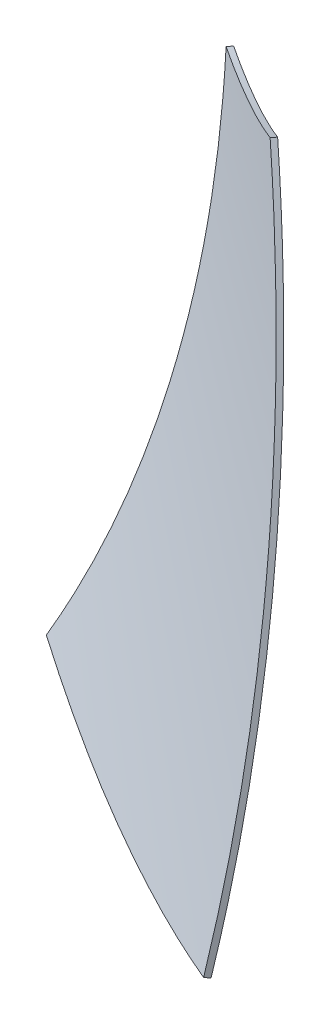
ISO-10303-21;
HEADER;
FILE_DESCRIPTION(('STEP AP214'),'2;1');
FILE_NAME('part.step','',(''),(''),'','','');
FILE_SCHEMA(('AUTOMOTIVE_DESIGN { 1 0 10303 214 1 1 1 1 }'));
ENDSEC;
DATA;
#1=APPLICATION_CONTEXT('core data for automotive mechanical design processes');
#2=APPLICATION_PROTOCOL_DEFINITION('international standard','automotive_design',2000,#1);
#3=PRODUCT_CONTEXT('',#1,'mechanical');
#4=PRODUCT('Part','Part','',(#3));
#5=PRODUCT_RELATED_PRODUCT_CATEGORY('part','',(#4));
#6=PRODUCT_DEFINITION_FORMATION('','',#4);
#7=PRODUCT_DEFINITION_CONTEXT('part definition',#1,'design');
#8=PRODUCT_DEFINITION('design','',#6,#7);
#9=PRODUCT_DEFINITION_SHAPE('','',#8);
#10=(LENGTH_UNIT() NAMED_UNIT(*) SI_UNIT(.MILLI.,.METRE.));
#11=(NAMED_UNIT(*) PLANE_ANGLE_UNIT() SI_UNIT($,.RADIAN.));
#12=(NAMED_UNIT(*) SI_UNIT($,.STERADIAN.) SOLID_ANGLE_UNIT());
#13=UNCERTAINTY_MEASURE_WITH_UNIT(LENGTH_MEASURE(1.E-05),#10,'distance_accuracy_value','');
#14=(GEOMETRIC_REPRESENTATION_CONTEXT(3) GLOBAL_UNCERTAINTY_ASSIGNED_CONTEXT((#13)) GLOBAL_UNIT_ASSIGNED_CONTEXT((#10,
#11,#12)) REPRESENTATION_CONTEXT('',''));
#15=CARTESIAN_POINT('',(0.,0.,0.));
#16=DIRECTION('',(0.,0.,1.));
#17=DIRECTION('',(1.,0.,0.));
#18=AXIS2_PLACEMENT_3D('',#15,#16,#17);
#19=CARTESIAN_POINT('',(78.7572236794685,-147.431615559738,-2.70380006520979));
#20=DIRECTION('',(0.,0.,1.));
#21=DIRECTION('',(1.,0.,0.));
#22=AXIS2_PLACEMENT_3D('',#19,#20,#21);
#23=CONICAL_SURFACE('',#22,60.5897364806192,0.959931088596881);
#24=CARTESIAN_POINT('',(134.605788151962,-170.731342459802,-2.75685890943691));
#25=CARTESIAN_POINT('',(134.616379422392,-170.599905018266,-2.78545030492909));
#26=CARTESIAN_POINT('',(134.626494640767,-170.468437161275,-2.81408465082089));
#27=CARTESIAN_POINT('',(134.674696797151,-169.810914395814,-2.95747729913719));
#28=CARTESIAN_POINT('',(134.705649660578,-169.284456858747,-3.07286623159333));
#29=CARTESIAN_POINT('',(134.752405609386,-168.231141664575,-3.30487191222422));
#30=CARTESIAN_POINT('',(134.76820871146,-167.70428400791,-3.42148865904589));
#31=CARTESIAN_POINT('',(134.780585250036,-166.914055799885,-3.5972602758251));
#32=CARTESIAN_POINT('',(134.782822871121,-166.650665898114,-3.6559896990414));
#33=CARTESIAN_POINT('',(134.78387792687,-165.860524444883,-3.8326053593522));
#34=CARTESIAN_POINT('',(134.77703639153,-165.333839934437,-3.95091040199067));
#35=CARTESIAN_POINT('',(134.755467554151,-164.544356782964,-4.12914125187959));
#36=CARTESIAN_POINT('',(134.746394061584,-164.281296012143,-4.18867820945749));
#37=CARTESIAN_POINT('',(134.713516518552,-163.492378807958,-4.36768755157999));
#38=CARTESIAN_POINT('',(134.684055908318,-162.966826440065,-4.48754965638362));
#39=CARTESIAN_POINT('',(134.628549070597,-162.179522634174,-4.66807514079438));
#40=CARTESIAN_POINT('',(134.608161764705,-161.917268475155,-4.72837011986974));
#41=CARTESIAN_POINT('',(134.541320382958,-161.131021855644,-4.90964328934642));
#42=CARTESIAN_POINT('',(134.489189043302,-160.607584560454,-5.03100075054007));
#43=CARTESIAN_POINT('',(134.369887819766,-159.562650395027,-5.27462133272372));
#44=CARTESIAN_POINT('',(134.302717953155,-159.041153522564,-5.39688445267364));
#45=CARTESIAN_POINT('',(134.153498987867,-158.000475071038,-5.64218771474003));
#46=CARTESIAN_POINT('',(134.071449905605,-157.481293489421,-5.76522785599921));
#47=CARTESIAN_POINT('',(133.892595398491,-156.44564029348,-6.01198001529259));
#48=CARTESIAN_POINT('',(133.795789984056,-155.929168677243,-6.13569203285243));
#49=CARTESIAN_POINT('',(133.587533246156,-154.89932712671,-6.38369513521577));
#50=CARTESIAN_POINT('',(133.476081927413,-154.385957191414,-6.50798621983248));
#51=CARTESIAN_POINT('',(133.238625080491,-153.362715863217,-6.75707079689549));
#52=CARTESIAN_POINT('',(133.112619551576,-152.852844470493,-6.88186428936714));
#53=CARTESIAN_POINT('',(132.846135034091,-151.837009863871,-7.13188782472667));
#54=CARTESIAN_POINT('',(132.705656039494,-151.331046651601,-7.25711786779628));
#55=CARTESIAN_POINT('',(132.31718431026,-150.005863701452,-7.58703763637144));
#56=CARTESIAN_POINT('',(132.057236898673,-149.190215835304,-7.79205738596347));
#57=CARTESIAN_POINT('',(131.778238301303,-148.381161591235,-7.99752302693639));
#58=B_SPLINE_CURVE_WITH_KNOTS('',3,(#24,#25,#26,#27,#28,#29,#30,#31,#32,#33,#34,#35,#36,#37,#38,
#39,#40,#41,#42,#43,#44,#45,#46,#47,#48,#49,#50,#51,#52,#53,#54,#55,#56,#57),.UNSPECIFIED.,.F.,
.F.,(4,2,2,2,2,2,2,2,2,2,2,2,2,2,2,2,4),(0.,0.404785646727015,2.02407998914106,3.6433725472241,
4.45295865029204,6.07225005229778,6.88183612887484,8.50112803684856,9.31071428467748,
10.9300078682216,12.5492995924441,14.1685895304152,15.7878783252783,17.4071665978865,
19.0264549522225,20.6457439807202,23.2857175866183),.UNSPECIFIED.);
#59=CARTESIAN_POINT('',(134.605788151962,-170.731342459802,-2.75685890943716));
#60=VERTEX_POINT('',#59);
#61=CARTESIAN_POINT('',(131.778238301303,-148.381161591235,-7.99752302693637));
#62=VERTEX_POINT('',#61);
#63=EDGE_CURVE('E23',#60,#62,#58,.T.);
#64=ORIENTED_EDGE('',*,*,#63,.T.);
#65=CARTESIAN_POINT('',(131.778238301303,-148.381161591235,-7.99752302693637));
#66=CARTESIAN_POINT('',(131.676082089635,-148.432906669615,-8.06839270908251));
#67=CARTESIAN_POINT('',(131.573463577942,-148.483385174219,-8.13954595753035));
#68=CARTESIAN_POINT('',(131.057913682385,-148.729617202499,-8.49686090490615));
#69=CARTESIAN_POINT('',(130.638510274614,-148.906424838884,-8.78704423252481));
#70=CARTESIAN_POINT('',(129.965302244953,-149.155460433756,-9.25266430868806));
#71=CARTESIAN_POINT('',(129.714699110871,-149.240708919067,-9.42595602925553));
#72=CARTESIAN_POINT('',(129.355390985677,-149.352601078064,-9.67445744911128));
#73=CARTESIAN_POINT('',(129.247832687924,-149.384788905845,-9.74885104371535));
#74=CARTESIAN_POINT('',(128.768539674748,-149.522465084773,-10.0804026850157));
#75=CARTESIAN_POINT('',(128.394166766565,-149.614661394808,-10.3394946224091));
#76=CARTESIAN_POINT('',(127.908854960768,-149.714768644672,-10.6757424971137));
#77=CARTESIAN_POINT('',(127.799550205187,-149.736054573479,-10.7514987942413));
#78=CARTESIAN_POINT('',(127.320584522723,-149.823809537646,-11.0835807574494));
#79=CARTESIAN_POINT('',(126.949494913093,-149.877442552936,-11.3411894895936));
#80=CARTESIAN_POINT('',(126.577335332167,-149.916836569792,-11.59999961285));
#81=B_SPLINE_CURVE_WITH_KNOTS('',3,(#65,#66,#67,#68,#69,#70,#71,#72,#73,#74,#75,#76,#77,#78,#79,
#80),.UNSPECIFIED.,.F.,.F.,(4,2,2,2,2,2,2,4),(0.,0.404039967202157,2.02138933713716,
2.97026784667493,3.37430460638505,4.76665393130048,5.17069019074693,6.53488990231797),.UNSPECIFIED.);
#82=CARTESIAN_POINT('',(126.57733532987,-149.916836570035,-11.5999996144474));
#83=VERTEX_POINT('',#82);
#84=EDGE_CURVE('E118',#62,#83,#81,.T.);
#85=ORIENTED_EDGE('',*,*,#84,.T.);
#86=CARTESIAN_POINT('',(126.57733532761,-149.916836569572,-11.5999996160448));
#87=CARTESIAN_POINT('',(126.570262013287,-150.052941781356,-11.5999996494659));
#88=CARTESIAN_POINT('',(126.562600085263,-150.189018799347,-11.6000047399862));
#89=CARTESIAN_POINT('',(126.52134828146,-150.869310846653,-11.6000530761268));
#90=CARTESIAN_POINT('',(126.47894309235,-151.413019044303,-11.6001649766074));
#91=CARTESIAN_POINT('',(126.375468099141,-152.498638332045,-11.6004735845136));
#92=CARTESIAN_POINT('',(126.31439831965,-153.040549424507,-11.6006702918274));
#93=CARTESIAN_POINT('',(126.173739377793,-154.121966756042,-11.6010958966157));
#94=CARTESIAN_POINT('',(126.094150235999,-154.661472997786,-11.6013247940543));
#95=CARTESIAN_POINT('',(125.916608138883,-155.737449210629,-11.6017712994759));
#96=CARTESIAN_POINT('',(125.818655199986,-156.273919184443,-11.6019889074689));
#97=CARTESIAN_POINT('',(125.604541866421,-157.343227337744,-11.6023789968134));
#98=CARTESIAN_POINT('',(125.48838148398,-157.876065519671,-11.6025514781953));
#99=CARTESIAN_POINT('',(125.300629870697,-158.672064328338,-11.6027589088289));
#100=CARTESIAN_POINT('',(125.235798048943,-158.936839890367,-11.6028195019013));
#101=CARTESIAN_POINT('',(125.034553127391,-159.729534789464,-11.602972686669));
#102=CARTESIAN_POINT('',(124.89140312878,-160.255764743476,-11.6030366646343));
#103=CARTESIAN_POINT('',(124.587332508507,-161.303046127741,-11.6030799623009));
#104=CARTESIAN_POINT('',(124.426411888593,-161.824097558504,-11.6030592820105));
#105=CARTESIAN_POINT('',(124.08697119315,-162.86045533843,-11.6029358242954));
#106=CARTESIAN_POINT('',(123.908451115275,-163.375761686827,-11.6028330468597));
#107=CARTESIAN_POINT('',(123.627641997148,-164.143883328966,-11.6026274061341));
#108=CARTESIAN_POINT('',(123.531872985049,-164.399103901087,-11.6025502856885));
#109=CARTESIAN_POINT('',(123.238048465891,-165.162342037329,-11.602297081799));
#110=CARTESIAN_POINT('',(123.03349488552,-165.667879992409,-11.6020991678247));
#111=CARTESIAN_POINT('',(122.607285311471,-166.671676100523,-11.6016733387503));
#112=CARTESIAN_POINT('',(122.385629305724,-167.169934248419,-11.601445423629));
#113=CARTESIAN_POINT('',(121.9254093993,-168.158599267833,-11.6009981951401));
#114=CARTESIAN_POINT('',(121.686845482937,-168.649006132067,-11.6007788817804));
#115=CARTESIAN_POINT('',(121.316518082209,-169.378204865842,-11.6004924206061));
#116=CARTESIAN_POINT('',(121.191002582458,-169.620189429101,-11.6004040220393));
#117=CARTESIAN_POINT('',(120.740581361943,-170.470604777717,-11.600129637712));
#118=CARTESIAN_POINT('',(120.404486637765,-171.073117536086,-11.6000013307999));
#119=CARTESIAN_POINT('',(120.055309686639,-171.668106511457,-11.599999616045));
#120=B_SPLINE_CURVE_WITH_KNOTS('',3,(#86,#87,#88,#89,#90,#91,#92,#93,#94,#95,#96,#97,#98,#99,
#100,#101,#102,#103,#104,#105,#106,#107,#108,#109,#110,#111,#112,#113,#114,#115,#116,#117,#118,
#119),.UNSPECIFIED.,.F.,.F.,(4,2,2,2,2,2,2,2,2,2,2,2,2,2,2,2,4),(0.,0.408872020867714,
2.0445880712592,3.68030196493978,5.31601404164167,6.95172465537327,8.58743417068849,
9.40520007433018,11.0409086409511,12.6766170468338,14.3123256708841,15.1300916008259,
16.7658012589311,18.4015120712798,20.0372244010418,20.8549909268166,22.9242005441206),.UNSPECIFIED.);
#121=CARTESIAN_POINT('',(120.055309688549,-171.668106529233,-11.5999996085917));
#122=VERTEX_POINT('',#121);
#123=EDGE_CURVE('E68',#83,#122,#120,.T.);
#124=ORIENTED_EDGE('',*,*,#123,.T.);
#125=CARTESIAN_POINT('',(120.05530969046,-171.668106547008,-11.5999996011384));
#126=CARTESIAN_POINT('',(120.167436927589,-171.683227183543,-11.5269277899671));
#127=CARTESIAN_POINT('',(120.27967512345,-171.697855483783,-11.4539216420114));
#128=CARTESIAN_POINT('',(120.616732153969,-171.740237152483,-11.2350974851369));
#129=CARTESIAN_POINT('',(120.8418759287,-171.766484765654,-11.0894852132953));
#130=CARTESIAN_POINT('',(121.180225060753,-171.802732751531,-10.8715030041362));
#131=CARTESIAN_POINT('',(121.293121535014,-171.814295534771,-10.79890994795));
#132=CARTESIAN_POINT('',(121.519117195239,-171.836367143061,-10.6538745044603));
#133=CARTESIAN_POINT('',(121.63221638493,-171.846875948522,-10.5814321199817));
#134=CARTESIAN_POINT('',(121.972363768017,-171.876822469324,-10.3639917884703));
#135=CARTESIAN_POINT('',(122.199712448089,-171.894621168894,-10.2192346185964));
#136=CARTESIAN_POINT('',(122.655102706292,-171.925989862103,-9.93034424876074));
#137=CARTESIAN_POINT('',(122.883144305428,-171.939559726233,-9.78621106804204));
#138=CARTESIAN_POINT('',(123.339795680005,-171.962830793169,-9.49849022503179));
#139=CARTESIAN_POINT('',(123.568405502072,-171.972531667196,-9.35490261012765));
#140=CARTESIAN_POINT('',(124.026159377397,-171.987773898679,-9.06836010831092));
#141=CARTESIAN_POINT('',(124.255303427241,-171.993315282636,-8.9254052173728));
#142=CARTESIAN_POINT('',(124.714080806761,-172.000040947843,-8.64018634924556));
#143=CARTESIAN_POINT('',(124.943714126804,-172.001225314084,-8.4979223586333));
#144=CARTESIAN_POINT('',(125.403408059095,-171.999129731051,-8.21412198035418));
#145=CARTESIAN_POINT('',(125.633468674846,-171.995849745019,-8.07258559868775));
#146=CARTESIAN_POINT('',(126.324117391908,-171.979339146702,-7.64911041754293));
#147=CARTESIAN_POINT('',(126.785239905162,-171.959438892242,-7.36826361088097));
#148=CARTESIAN_POINT('',(127.476857356153,-171.916591389211,-6.94955539336827));
#149=CARTESIAN_POINT('',(127.70710813763,-171.9001702724,-6.8105788589419));
#150=CARTESIAN_POINT('',(128.167681959757,-171.863022231064,-6.53337967033593));
#151=CARTESIAN_POINT('',(128.398004989143,-171.842295798785,-6.39515693182397));
#152=CARTESIAN_POINT('',(129.08902636021,-171.77367482908,-5.98159607607306));
#153=CARTESIAN_POINT('',(129.549766238453,-171.719339285448,-5.70737182091689));
#154=CARTESIAN_POINT('',(130.470731870811,-171.59343826166,-5.16201971943314));
#155=CARTESIAN_POINT('',(130.930957623737,-171.52187274172,-4.89089188025676));
#156=CARTESIAN_POINT('',(131.620396203786,-171.401434367381,-4.48668233293494));
#157=CARTESIAN_POINT('',(131.850047699047,-171.359108981576,-4.35236611271707));
#158=CARTESIAN_POINT('',(132.501930077152,-171.232610822881,-3.97199678509201));
#159=CARTESIAN_POINT('',(132.923739345775,-171.143173179397,-3.72694440622015));
#160=CARTESIAN_POINT('',(133.766017522951,-170.948897956325,-3.23966262907043));
#161=CARTESIAN_POINT('',(134.186484679992,-170.844045140587,-2.99743628264901));
#162=CARTESIAN_POINT('',(134.605788151962,-170.731342459802,-2.75685890943752));
#163=B_SPLINE_CURVE_WITH_KNOTS('',3,(#125,#126,#127,#128,#129,#130,#131,#132,#133,#134,#135,
#136,#137,#138,#139,#140,#141,#142,#143,#144,#145,#146,#147,#148,#149,#150,#151,#152,#153,#154,
#155,#156,#157,#158,#159,#160,#161,#162),.UNSPECIFIED.,.F.,.F.,(4,2,2,2,2,2,2,2,2,2,2,2,2,2,2,2,
2,2,4),(0.,0.404064075829709,1.21225542173454,1.61640715853335,2.02056640495023,2.8308531195042,
3.64116464685769,4.45154501796617,5.26192022580696,6.07227962579751,6.88264569796902,
8.50313937763985,9.31144122089318,10.1196506981843,11.7361073687768,13.3525677718332,
14.1607178925077,15.6483250247952,17.1374124981753),.UNSPECIFIED.);
#164=EDGE_CURVE('E65',#122,#60,#163,.T.);
#165=ORIENTED_EDGE('',*,*,#164,.T.);
#166=EDGE_LOOP('',(#64,#85,#124,#165));
#167=FACE_BOUND('',#166,.T.);
#168=ADVANCED_FACE('F16',(#167),#23,.F.);
#169=CARTESIAN_POINT('',(131.894082165788,-148.383236223013,-8.16299173988275));
#170=CARTESIAN_POINT('',(131.893699842803,-148.383229376043,-8.16244563851989));
#171=CARTESIAN_POINT('',(131.893317519818,-148.383222529074,-8.16189953715703));
#172=CARTESIAN_POINT('',(131.892935196833,-148.383215682104,-8.16135343579417));
#173=CARTESIAN_POINT('',(131.854702898323,-148.382530985148,-8.10674329950824));
#174=CARTESIAN_POINT('',(131.816470599813,-148.381846288191,-8.05213316322231));
#175=CARTESIAN_POINT('',(131.778238301303,-148.381161591235,-7.99752302693637));
#176=CARTESIAN_POINT('',(133.299440158477,-152.467639566394,-7.12789737510281));
#177=CARTESIAN_POINT('',(133.299058354373,-152.467603503838,-7.12735127373995));
#178=CARTESIAN_POINT('',(133.298676550269,-152.467567441283,-7.12680517237709));
#179=CARTESIAN_POINT('',(133.298294746165,-152.467531378727,-7.12625907101423));
#180=CARTESIAN_POINT('',(133.260114335778,-152.463925123164,-7.0716489347283));
#181=CARTESIAN_POINT('',(133.221935126975,-152.460324418764,-7.01703879844237));
#182=CARTESIAN_POINT('',(133.183754716589,-152.456718163202,-6.96242866215643));
#183=CARTESIAN_POINT('',(134.929019860243,-159.974452727746,-5.31572352005377));
#184=CARTESIAN_POINT('',(134.928644826751,-159.974367365664,-5.31517741869091));
#185=CARTESIAN_POINT('',(134.92826979326,-159.974282003582,-5.31463131732805));
#186=CARTESIAN_POINT('',(134.927894759768,-159.9741966415,-5.31408521596519));
#187=CARTESIAN_POINT('',(134.890391410609,-159.965660433293,-5.25947507967926));
#188=CARTESIAN_POINT('',(134.852887826046,-159.957121979647,-5.20486494339333));
#189=CARTESIAN_POINT('',(134.815384476887,-159.94858577144,-5.1502548071074));
#190=CARTESIAN_POINT('',(134.972016657127,-167.580555158911,-3.61624611019746));
#191=CARTESIAN_POINT('',(134.971656349512,-167.580425672958,-3.6157000088346));
#192=CARTESIAN_POINT('',(134.971296041898,-167.580296187006,-3.61515390747174));
#193=CARTESIAN_POINT('',(134.970935734283,-167.580166701053,-3.61460780610888));
#194=CARTESIAN_POINT('',(134.934904972825,-167.567218105797,-3.55999766982295));
#195=CARTESIAN_POINT('',(134.898874206017,-167.554270327607,-3.50538753353701));
#196=CARTESIAN_POINT('',(134.862843444559,-167.54132173235,-3.45077739725108));
#197=CARTESIAN_POINT('',(134.71271803879,-170.775953045303,-2.9223276223833));
#198=CARTESIAN_POINT('',(134.712365134873,-170.775805815648,-2.92178152102044));
#199=CARTESIAN_POINT('',(134.712012230956,-170.775658585993,-2.92123541965758));
#200=CARTESIAN_POINT('',(134.711659327039,-170.775511356338,-2.92068931829472));
#201=CARTESIAN_POINT('',(134.676368935347,-170.760788390826,-2.86607918200879));
#202=CARTESIAN_POINT('',(134.641078543655,-170.746065425314,-2.81146904572285));
#203=CARTESIAN_POINT('',(134.605788151962,-170.731342459802,-2.75685890943692));
#204=B_SPLINE_SURFACE_WITH_KNOTS('',3,3,((#169,#170,#171,#172,#173,#174,#175),(#176,#177,#178,
#179,#180,#181,#182),(#183,#184,#185,#186,#187,#188,#189),(#190,#191,#192,#193,#194,#195,#196),
(#197,#198,#199,#200,#201,#202,#203)),.UNSPECIFIED.,.F.,.F.,.F.,(4,1,4),(4,3,4),(0.,
0.571428571428571,1.),(-0.01,0.,1.),.UNSPECIFIED.);
#205=DIRECTION('',(-0.573484477649756,0.0102704543403194,0.819152044288745));
#206=VECTOR('',#205,1.);
#207=CARTESIAN_POINT('',(131.83501326459,-148.382178366215,-8.07861907932101));
#208=LINE('',#207,#206);
#209=CARTESIAN_POINT('',(131.890275275419,-148.383168642678,-8.15755361789312));
#210=VERTEX_POINT('',#209);
#211=EDGE_CURVE('E77',#210,#62,#208,.T.);
#212=DIRECTION('',(0.529355875382127,-0.220844482681004,-0.819152044292011));
#213=VECTOR('',#212,1.);
#214=CARTESIAN_POINT('',(134.6587237395,-170.75342690807,-2.8387741138661));
#215=LINE('',#214,#213);
#216=CARTESIAN_POINT('',(134.711659335653,-170.775511354014,-2.92068931335499));
#217=VERTEX_POINT('',#216);
#218=EDGE_CURVE('E72',#60,#217,#215,.T.);
#219=CARTESIAN_POINT('',(131.890275482189,-148.38316924312,-8.15755346593866));
#220=CARTESIAN_POINT('',(131.932578488578,-148.506013266826,-8.12646529974278));
#221=CARTESIAN_POINT('',(131.974443426525,-148.629012222785,-8.09538664209419));
#222=CARTESIAN_POINT('',(132.181590329431,-149.244807770085,-7.94003123078418));
#223=CARTESIAN_POINT('',(132.340292884504,-149.739873965315,-7.81590172399869));
#224=CARTESIAN_POINT('',(132.643601171173,-150.734379727811,-7.56799614008737));
#225=CARTESIAN_POINT('',(132.788206916985,-151.233819290665,-7.44422006260523));
#226=CARTESIAN_POINT('',(133.06327064616,-152.236683446434,-7.19705831847666));
#227=CARTESIAN_POINT('',(133.193728638925,-152.740108036701,-7.07367265157083));
#228=CARTESIAN_POINT('',(133.440421235467,-153.750516016524,-6.82735523018195));
#229=CARTESIAN_POINT('',(133.556655843781,-154.257499404946,-6.70442347555413));
#230=CARTESIAN_POINT('',(133.883994226757,-155.783643426141,-6.33630232355147));
#231=CARTESIAN_POINT('',(134.073654535592,-156.80771335659,-6.09185713269323));
#232=CARTESIAN_POINT('',(134.314517920459,-158.350729866243,-5.72736741440274));
#233=CARTESIAN_POINT('',(134.387527309107,-158.866147414491,-5.60625079154462));
#234=CARTESIAN_POINT('',(134.518906359033,-159.899066828554,-5.36481911959935));
#235=CARTESIAN_POINT('',(134.577276003636,-160.416568696742,-5.24450407142532));
#236=CARTESIAN_POINT('',(134.653725510535,-161.194024279569,-5.06474735316981));
#237=CARTESIAN_POINT('',(134.677357201017,-161.45336723249,-5.00494989898643));
#238=CARTESIAN_POINT('',(134.742708648277,-162.232001284413,-4.82590183247308));
#239=CARTESIAN_POINT('',(134.778880549789,-162.751860052717,-4.70700423832347));
#240=CARTESIAN_POINT('',(134.822058176357,-163.532361762357,-4.52940295256688));
#241=CARTESIAN_POINT('',(134.834603759245,-163.792638438459,-4.47032884487121));
#242=CARTESIAN_POINT('',(134.888124946639,-165.094986136432,-4.17547408939976));
#243=CARTESIAN_POINT('',(134.901412813862,-166.138825306815,-3.94149714261485));
#244=CARTESIAN_POINT('',(134.875764846212,-167.781803936912,-3.57668920994814));
#245=CARTESIAN_POINT('',(134.856657822295,-168.381030399083,-3.44436265463065));
#246=CARTESIAN_POINT('',(134.798862828021,-169.578859612488,-3.18130319049114));
#247=CARTESIAN_POINT('',(134.760175740196,-170.177462390615,-3.05057021011384));
#248=CARTESIAN_POINT('',(134.711659331516,-170.77551130116,-2.92068933027753));
#249=B_SPLINE_CURVE_WITH_KNOTS('',3,(#219,#220,#221,#222,#223,#224,#225,#226,#227,#228,#229,
#230,#231,#232,#233,#234,#235,#236,#237,#238,#239,#240,#241,#242,#243,#244,#245,#246,#247,#248),
.UNSPECIFIED.,.F.,.F.,(4,2,2,2,2,2,2,2,2,2,2,2,2,2,4),(0.,0.400777767878898,2.00403326314162,
3.60728714148174,5.21053995438169,6.81379225591896,10.0212055219878,11.6244597112299,
13.2277157265327,14.0292859402486,15.6325425997919,16.4341125799421,19.641548052603,
21.4831693810971,23.3247077095701),.UNSPECIFIED.);
#250=EDGE_CURVE('E112',#210,#217,#249,.T.);
#251=ORIENTED_EDGE('',*,*,#211,.T.);
#252=ORIENTED_EDGE('',*,*,#63,.F.);
#253=ORIENTED_EDGE('',*,*,#218,.T.);
#254=ORIENTED_EDGE('',*,*,#250,.F.);
#255=EDGE_LOOP('',(#251,#252,#253,#254));
#256=FACE_BOUND('',#255,.T.);
#257=ADVANCED_FACE('F74',(#256),#204,.F.);
#258=CARTESIAN_POINT('',(134.71271803879,-170.775953045303,-2.9223276223835));
#259=CARTESIAN_POINT('',(134.712365134873,-170.775805815648,-2.92178152102064));
#260=CARTESIAN_POINT('',(134.712012230956,-170.775658585993,-2.92123541965778));
#261=CARTESIAN_POINT('',(134.711659327039,-170.775511356338,-2.92068931829492));
#262=CARTESIAN_POINT('',(134.676368935347,-170.760788390826,-2.86607918200904));
#263=CARTESIAN_POINT('',(134.641078543654,-170.746065425314,-2.81146904572316));
#264=CARTESIAN_POINT('',(134.605788151962,-170.731342459802,-2.75685890943729));
#265=CARTESIAN_POINT('',(134.605431719006,-170.73119375785,-2.7563073470608));
#266=CARTESIAN_POINT('',(134.60507528605,-170.731045055899,-2.75575578468432));
#267=CARTESIAN_POINT('',(134.604718853094,-170.730896353947,-2.75520422230783));
#268=CARTESIAN_POINT('',(131.858716817371,-171.546038258217,-4.55903629348519));
#269=CARTESIAN_POINT('',(131.858368305276,-171.545880487361,-4.55849019212233));
#270=CARTESIAN_POINT('',(131.858019793182,-171.545722716504,-4.55794409075947));
#271=CARTESIAN_POINT('',(131.857671281088,-171.545564945648,-4.55739798939661));
#272=CARTESIAN_POINT('',(131.822820071663,-171.52978786002,-4.50278785311072));
#273=CARTESIAN_POINT('',(131.787969605582,-171.514013243101,-4.44817771682483));
#274=CARTESIAN_POINT('',(131.753118396156,-171.498236157473,-4.39356758053894));
#275=CARTESIAN_POINT('',(131.752766398941,-171.498076808908,-4.39301601816245));
#276=CARTESIAN_POINT('',(131.752414401726,-171.497917460343,-4.39246445578597));
#277=CARTESIAN_POINT('',(131.75206240451,-171.497758111778,-4.39191289340948));
#278=CARTESIAN_POINT('',(127.884208646433,-172.095860493621,-6.90070099144764));
#279=CARTESIAN_POINT('',(127.88386648746,-172.095689390152,-6.90015489008478));
#280=CARTESIAN_POINT('',(127.883524328486,-172.095518286684,-6.89960878872192));
#281=CARTESIAN_POINT('',(127.883182169512,-172.095347183215,-6.89906268735906));
#282=CARTESIAN_POINT('',(127.848966272135,-172.078236836353,-6.84445255107315));
#283=CARTESIAN_POINT('',(127.814749724108,-172.061127843676,-6.78984241478726));
#284=CARTESIAN_POINT('',(127.780533826732,-172.044017496814,-6.73523227850135));
#285=CARTESIAN_POINT('',(127.780188246168,-172.043844682311,-6.73468071612486));
#286=CARTESIAN_POINT('',(127.779842665605,-172.043671867807,-6.73412915374837));
#287=CARTESIAN_POINT('',(127.779497085041,-172.043499053304,-6.73357759137189));
#288=CARTESIAN_POINT('',(123.926690346646,-172.055469637622,-9.3552289579688));
#289=CARTESIAN_POINT('',(123.926354550327,-172.055286681247,-9.35468285660594));
#290=CARTESIAN_POINT('',(123.926018754009,-172.055103724873,-9.35413675524308));
#291=CARTESIAN_POINT('',(123.92568295769,-172.054920768498,-9.35359065388022));
#292=CARTESIAN_POINT('',(123.892103325816,-172.03662513103,-9.2989805175943));
#293=CARTESIAN_POINT('',(123.858524926945,-172.018326854063,-9.24437038130838));
#294=CARTESIAN_POINT('',(123.82494529507,-172.000031216595,-9.18976024502247));
#295=CARTESIAN_POINT('',(123.824606140788,-171.999846430657,-9.18920868264598));
#296=CARTESIAN_POINT('',(123.824266986506,-171.999661644718,-9.18865712026949));
#297=CARTESIAN_POINT('',(123.823927832224,-171.99947685878,-9.18810555789301));
#298=CARTESIAN_POINT('',(121.870883025791,-171.927974577641,-10.6558105147884));
#299=CARTESIAN_POINT('',(121.870550526431,-171.927785706276,-10.6552644134255));
#300=CARTESIAN_POINT('',(121.870218027071,-171.92759683491,-10.6547183120627));
#301=CARTESIAN_POINT('',(121.869885527711,-171.927407963545,-10.6541722106998));
#302=CARTESIAN_POINT('',(121.836635591713,-171.908520826998,-10.5995620744139));
#303=CARTESIAN_POINT('',(121.803384450612,-171.889636664793,-10.5449519381279));
#304=CARTESIAN_POINT('',(121.770134514614,-171.870749528246,-10.490341801842));
#305=CARTESIAN_POINT('',(121.76979869026,-171.870558768167,-10.4897902394655));
#306=CARTESIAN_POINT('',(121.769462865907,-171.870368008088,-10.489238677089));
#307=CARTESIAN_POINT('',(121.769127041553,-171.870177248009,-10.4886871147125));
#308=CARTESIAN_POINT('',(120.843558007019,-171.818965759095,-11.3171126533402));
#309=CARTESIAN_POINT('',(120.843227128988,-171.818774080378,-11.3165665519773));
#310=CARTESIAN_POINT('',(120.842896250956,-171.818582401661,-11.3160204506145));
#311=CARTESIAN_POINT('',(120.842565372925,-171.818390722944,-11.3154743492516));
#312=CARTESIAN_POINT('',(120.809477569791,-171.799222851259,-11.2608642129657));
#313=CARTESIAN_POINT('',(120.776391826752,-171.780050381983,-11.2062540766797));
#314=CARTESIAN_POINT('',(120.743304023618,-171.760882510297,-11.1516439403938));
#315=CARTESIAN_POINT('',(120.742969836806,-171.760688914793,-11.1510923780173));
#316=CARTESIAN_POINT('',(120.742635649995,-171.760495319289,-11.1505408156408));
#317=CARTESIAN_POINT('',(120.742301463183,-171.760301723785,-11.1499892532643));
#318=CARTESIAN_POINT('',(120.155235192587,-171.726749540529,-11.7654683091632));
#319=CARTESIAN_POINT('',(120.154905405477,-171.7265559993,-11.7649222078003));
#320=CARTESIAN_POINT('',(120.154575618366,-171.72636245807,-11.7643761064375));
#321=CARTESIAN_POINT('',(120.154245831255,-171.726168916841,-11.7638300050746));
#322=CARTESIAN_POINT('',(120.121267120174,-171.706814793903,-11.7092198687886));
#323=CARTESIAN_POINT('',(120.088288409093,-171.687460670965,-11.6546097325027));
#324=CARTESIAN_POINT('',(120.055309698012,-171.668106548026,-11.5999995962168));
#325=CARTESIAN_POINT('',(120.05497661303,-171.667911071384,-11.5994480338403));
#326=CARTESIAN_POINT('',(120.054643528048,-171.667715594743,-11.5988964714638));
#327=CARTESIAN_POINT('',(120.054310443066,-171.667520118101,-11.5983449090873));
#328=B_SPLINE_SURFACE_WITH_KNOTS('',3,3,((#258,#259,#260,#261,#262,#263,#264,#265,#266,#267),
(#268,#269,#270,#271,#272,#273,#274,#275,#276,#277),(#278,#279,#280,#281,#282,#283,#284,#285,
#286,#287),(#288,#289,#290,#291,#292,#293,#294,#295,#296,#297),(#298,#299,#300,#301,#302,#303,
#304,#305,#306,#307),(#308,#309,#310,#311,#312,#313,#314,#315,#316,#317),(#318,#319,#320,#321,
#322,#323,#324,#325,#326,#327)),.UNSPECIFIED.,.F.,.F.,.F.,(4,1,1,1,4),(4,3,3,4),(0.,
0.571428571428571,0.785714285714286,0.857142857142857,1.),(-0.01,0.,1.,1.0101),.UNSPECIFIED.);
#329=DIRECTION('',(0.49468066636607,-0.290311843817023,-0.819152044289204));
#330=VECTOR('',#329,1.);
#331=CARTESIAN_POINT('',(120.105661572297,-171.697656351614,-11.6833783341765));
#332=LINE('',#331,#330);
#333=CARTESIAN_POINT('',(120.153946954336,-171.725993386877,-11.7633350556308));
#334=VERTEX_POINT('',#333);
#335=EDGE_CURVE('E83',#122,#334,#332,.T.);
#336=CARTESIAN_POINT('',(134.711659344267,-170.77551135169,-2.92068930841487));
#337=CARTESIAN_POINT('',(134.599022770779,-170.805901993809,-2.98528436390957));
#338=CARTESIAN_POINT('',(134.486299765155,-170.835724902134,-3.04999990561551));
#339=CARTESIAN_POINT('',(133.922219670511,-170.982036947639,-3.37420320270312));
#340=CARTESIAN_POINT('',(133.469655072972,-171.090067313734,-3.63546016748508));
#341=CARTESIAN_POINT('',(132.561511635591,-171.288855881896,-4.16211517063904));
#342=CARTESIAN_POINT('',(132.10592798725,-171.379567586175,-4.42752234322105));
#343=CARTESIAN_POINT('',(131.193521143483,-171.54376092728,-4.96160385690283));
#344=CARTESIAN_POINT('',(130.736697851965,-171.617241187429,-5.23027845724542));
#345=CARTESIAN_POINT('',(129.82247016803,-171.74719997307,-5.77069154569681));
#346=CARTESIAN_POINT('',(129.365065791819,-171.803678962739,-6.04242994994573));
#347=CARTESIAN_POINT('',(128.45028238319,-171.899715533104,-6.58884192089342));
#348=CARTESIAN_POINT('',(127.99290335274,-171.93927478701,-6.86351519460501));
#349=CARTESIAN_POINT('',(127.307922470594,-171.985801157298,-7.27730498110584));
#350=CARTESIAN_POINT('',(127.080086093773,-171.99916501384,-7.4153425081823));
#351=CARTESIAN_POINT('',(126.624609017175,-172.021628298701,-7.69215125374788));
#352=CARTESIAN_POINT('',(126.396968343375,-172.030727228522,-7.83092255608692));
#353=CARTESIAN_POINT('',(125.941986149007,-172.044603099378,-8.10918824223283));
#354=CARTESIAN_POINT('',(125.714644639884,-172.049379879603,-8.24868265274926));
#355=CARTESIAN_POINT('',(125.26035600041,-172.054569140881,-8.52838545074058));
#356=CARTESIAN_POINT('',(125.033408864102,-172.054981688442,-8.66859382730226));
#357=CARTESIAN_POINT('',(124.579974532421,-172.051516872873,-8.94969561674471));
#358=CARTESIAN_POINT('',(124.353487334352,-172.047639534972,-9.09058902559191));
#359=CARTESIAN_POINT('',(123.901028587261,-172.035740825325,-9.37301290457971));
#360=CARTESIAN_POINT('',(123.675057026405,-172.027719549666,-9.51454335987343));
#361=CARTESIAN_POINT('',(123.223635195468,-172.007844329534,-9.79816494862187));
#362=CARTESIAN_POINT('',(122.998184926433,-171.995990377375,-9.94025608320025));
#363=CARTESIAN_POINT('',(122.553479969642,-171.968677340149,-10.2214816295592));
#364=CARTESIAN_POINT('',(122.334210422554,-171.953315062348,-10.3606018695906));
#365=CARTESIAN_POINT('',(121.896383172709,-171.918516568388,-10.639449919674));
#366=CARTESIAN_POINT('',(121.677825465558,-171.899080377422,-10.7791777259636));
#367=CARTESIAN_POINT('',(121.24125246558,-171.856256199712,-11.0593338440002));
#368=CARTESIAN_POINT('',(121.023237890187,-171.832864456324,-11.1997626973395));
#369=CARTESIAN_POINT('',(120.587993764444,-171.782262563482,-11.4811561474753));
#370=CARTESIAN_POINT('',(120.370764226568,-171.755052353619,-11.6221207527132));
#371=CARTESIAN_POINT('',(120.15394705232,-171.72599351449,-11.7633349512188));
#372=B_SPLINE_CURVE_WITH_KNOTS('',3,(#336,#337,#338,#339,#340,#341,#342,#343,#344,#345,#346,
#347,#348,#349,#350,#351,#352,#353,#354,#355,#356,#357,#358,#359,#360,#361,#362,#363,#364,#365,
#366,#367,#368,#369,#370,#371),.UNSPECIFIED.,.F.,.F.,(4,2,2,2,2,2,2,2,2,2,2,2,2,2,2,2,2,4),(0.,
0.400064412571046,2.00054437172465,3.60526272447642,5.21010923969993,6.81491193452582,
8.41955589197793,9.21970311274269,10.0199438339333,10.8202143274028,11.6204726249607,
12.4207262161695,13.2209612524099,14.0211978932216,14.8015678042819,15.5819328896222,
16.3630433043342,17.1441660777518),.UNSPECIFIED.);
#373=EDGE_CURVE('E80',#217,#334,#372,.T.);
#374=ORIENTED_EDGE('',*,*,#218,.F.);
#375=ORIENTED_EDGE('',*,*,#164,.F.);
#376=ORIENTED_EDGE('',*,*,#335,.T.);
#377=ORIENTED_EDGE('',*,*,#373,.F.);
#378=EDGE_LOOP('',(#374,#375,#376,#377));
#379=FACE_BOUND('',#378,.T.);
#380=ADVANCED_FACE('F78',(#379),#328,.F.);
#381=CARTESIAN_POINT('',(120.156013213605,-171.727206076965,-11.766756668353));
#382=CARTESIAN_POINT('',(120.155424163824,-171.726860382986,-11.7657812485213));
#383=CARTESIAN_POINT('',(120.154835114043,-171.726514689006,-11.7648058286895));
#384=CARTESIAN_POINT('',(120.154246064262,-171.726168995027,-11.7638304088578));
#385=CARTESIAN_POINT('',(120.121267353171,-171.706814872106,-11.7092202725719));
#386=CARTESIAN_POINT('',(120.08828864208,-171.687460749185,-11.6546101362859));
#387=CARTESIAN_POINT('',(120.055309930989,-171.668106626264,-11.6));
#388=CARTESIAN_POINT('',(120.05497425338,-171.667909628095,-11.5994441444388));
#389=CARTESIAN_POINT('',(120.054638575772,-171.667712629926,-11.5988882888776));
#390=CARTESIAN_POINT('',(120.054302898163,-171.667515631757,-11.5983324333165));
#391=CARTESIAN_POINT('',(124.033456524683,-165.120186411165,-11.766756668353));
#392=CARTESIAN_POINT('',(124.032812201987,-165.119934691289,-11.7657812485213));
#393=CARTESIAN_POINT('',(124.032167879292,-165.119682971412,-11.7648058286895));
#394=CARTESIAN_POINT('',(124.031523556596,-165.119431251535,-11.7638304088578));
#395=CARTESIAN_POINT('',(123.995450320151,-165.105338389845,-11.7092202725719));
#396=CARTESIAN_POINT('',(123.959394224129,-165.091251408765,-11.6546101362859));
#397=CARTESIAN_POINT('',(123.923320987683,-165.077158547075,-11.6));
#398=CARTESIAN_POINT('',(123.922953812092,-165.077015101259,-11.5994441444388));
#399=CARTESIAN_POINT('',(123.9225866365,-165.076871655444,-11.5988882888776));
#400=CARTESIAN_POINT('',(123.922219460909,-165.076728209628,-11.5983324333165));
#401=CARTESIAN_POINT('',(126.296348017702,-157.573334180074,-11.766756668353));
#402=CARTESIAN_POINT('',(126.295671494639,-157.573189849976,-11.7657812485213));
#403=CARTESIAN_POINT('',(126.294994971575,-157.573045519878,-11.7648058286895));
#404=CARTESIAN_POINT('',(126.294318448512,-157.57290118978,-11.7638304088578));
#405=CARTESIAN_POINT('',(126.25644243298,-157.564820683256,-11.7092202725719));
#406=CARTESIAN_POINT('',(126.218583965656,-157.55674469736,-11.6546101362859));
#407=CARTESIAN_POINT('',(126.180707950124,-157.548664190836,-11.6));
#408=CARTESIAN_POINT('',(126.180322424738,-157.54858194247,-11.5994441444388));
#409=CARTESIAN_POINT('',(126.179936899352,-157.548499694104,-11.5988882888776));
#410=CARTESIAN_POINT('',(126.179551373966,-157.548417445737,-11.5983324333165));
#411=CARTESIAN_POINT('',(126.693942506577,-149.922896668577,-11.766756668353));
#412=CARTESIAN_POINT('',(126.693260430747,-149.922861220957,-11.7657812485213));
#413=CARTESIAN_POINT('',(126.692578354917,-149.922825773336,-11.7648058286895));
#414=CARTESIAN_POINT('',(126.691896279087,-149.922790325715,-11.7638304088578));
#415=CARTESIAN_POINT('',(126.653709384757,-149.920805744985,-11.7092202725719));
#416=CARTESIAN_POINT('',(126.615522490426,-149.918821164255,-11.6546101362859));
#417=CARTESIAN_POINT('',(126.577335596096,-149.916836583525,-11.6));
#418=CARTESIAN_POINT('',(126.576946906394,-149.916816383241,-11.5994441444388));
#419=CARTESIAN_POINT('',(126.576558216693,-149.916796182958,-11.5988882888776));
#420=CARTESIAN_POINT('',(126.576169526991,-149.916775982674,-11.5983324333165));
#421=B_SPLINE_SURFACE_WITH_KNOTS('',3,3,((#381,#382,#383,#384,#385,#386,#387,#388,#389,#390),
(#391,#392,#393,#394,#395,#396,#397,#398,#399,#400),(#401,#402,#403,#404,#405,#406,#407,#408,
#409,#410),(#411,#412,#413,#414,#415,#416,#417,#418,#419,#420)),.UNSPECIFIED.,.F.,.F.,.F.,(4,4),
(4,3,3,4),(0.,1.),(-0.0178615161592212,0.,1.,1.01017861516159),.UNSPECIFIED.);
#422=DIRECTION('',(0.572803414962045,-0.0297687109648737,-0.819152044284398));
#423=VECTOR('',#422,1.);
#424=CARTESIAN_POINT('',(126.634042870146,-149.919783672187,-11.6810956653055));
#425=LINE('',#424,#423);
#426=CARTESIAN_POINT('',(126.689691408576,-149.922675747902,-11.7606773996095));
#427=VERTEX_POINT('',#426);
#428=EDGE_CURVE('E44',#83,#427,#425,.T.);
#429=CARTESIAN_POINT('',(120.153946985052,-171.72599333455,-11.7633350556401));
#430=CARTESIAN_POINT('',(120.222941282106,-171.608458457183,-11.7633558068638));
#431=CARTESIAN_POINT('',(120.291429411224,-171.49062368828,-11.7633809560979));
#432=CARTESIAN_POINT('',(120.631366255736,-170.899910992539,-11.7635263085442));
#433=CARTESIAN_POINT('',(120.895187967419,-170.422612154932,-11.7637052995405));
#434=CARTESIAN_POINT('',(121.406285319138,-169.45925647959,-11.7641272290208));
#435=CARTESIAN_POINT('',(121.653560980844,-168.973199653326,-11.7643701674211));
#436=CARTESIAN_POINT('',(122.131353607765,-167.992913441847,-11.764867537379));
#437=CARTESIAN_POINT('',(122.361870591481,-167.498684065655,-11.765121968924));
#438=CARTESIAN_POINT('',(122.805928865768,-166.502663595483,-11.7655989597036));
#439=CARTESIAN_POINT('',(123.019470171441,-166.00087250823,-11.7658215189666));
#440=CARTESIAN_POINT('',(123.429380464581,-164.990310040525,-11.7662009936042));
#441=CARTESIAN_POINT('',(123.625749463535,-164.481538664742,-11.7663579090227));
#442=CARTESIAN_POINT('',(123.907250696811,-163.713670642079,-11.7665266172834));
#443=CARTESIAN_POINT('',(123.998904453194,-163.45694350636,-11.76657174192));
#444=CARTESIAN_POINT('',(124.267343259114,-162.684412084026,-11.7666708248364));
#445=CARTESIAN_POINT('',(124.437584687689,-162.166312603358,-11.7666884745784));
#446=CARTESIAN_POINT('',(124.760410228347,-161.124660350935,-11.7666185410434));
#447=CARTESIAN_POINT('',(124.912994342216,-160.601107579732,-11.7665309577771));
#448=CARTESIAN_POINT('',(125.200336959591,-159.549114194141,-11.7662530005997));
#449=CARTESIAN_POINT('',(125.335095460812,-159.020673579126,-11.7660626266755));
#450=CARTESIAN_POINT('',(125.523715762233,-158.224880663588,-11.7657099629042));
#451=CARTESIAN_POINT('',(125.584333386273,-157.959108760584,-11.7655812332411));
#452=CARTESIAN_POINT('',(125.75942256945,-157.160229293727,-11.765165330146));
#453=CARTESIAN_POINT('',(125.867115835102,-156.62561523904,-11.7648484640714));
#454=CARTESIAN_POINT('',(126.064248713767,-155.553049160634,-11.764163552085));
#455=CARTESIAN_POINT('',(126.15368831409,-155.015097134594,-11.7637955061376));
#456=CARTESIAN_POINT('',(126.314162386465,-153.936437314025,-11.7630465624776));
#457=CARTESIAN_POINT('',(126.385196841671,-153.395729516975,-11.762665664753));
#458=CARTESIAN_POINT('',(126.477823702454,-152.583145629462,-11.7621205348339));
#459=CARTESIAN_POINT('',(126.506377339549,-152.312045485273,-11.7619432032762));
#460=CARTESIAN_POINT('',(126.600715278405,-151.336044025017,-11.7613338814408));
#461=CARTESIAN_POINT('',(126.653125557253,-150.629842066254,-11.7609475150587));
#462=CARTESIAN_POINT('',(126.689691406268,-149.922676893538,-11.7606773602365));
#463=B_SPLINE_CURVE_WITH_KNOTS('',3,(#429,#430,#431,#432,#433,#434,#435,#436,#437,#438,#439,
#440,#441,#442,#443,#444,#445,#446,#447,#448,#449,#450,#451,#452,#453,#454,#455,#456,#457,#458,
#459,#460,#461,#462),.UNSPECIFIED.,.F.,.F.,(4,2,2,2,2,2,2,2,2,2,2,2,2,2,2,2,4),(0.,
0.408872008502815,2.04458727513361,3.68030039963031,5.31601171846133,6.95172158220048,
8.58743035184821,9.40519616246568,11.0409039830898,12.6766116381775,14.3123195029994,
15.1300853369005,16.7657942164909,18.4015042332367,20.0372157471487,20.8549821686442,
22.9788418860423),.UNSPECIFIED.);
#464=EDGE_CURVE('E35',#334,#427,#463,.T.);
#465=ORIENTED_EDGE('',*,*,#335,.F.);
#466=ORIENTED_EDGE('',*,*,#123,.F.);
#467=ORIENTED_EDGE('',*,*,#428,.T.);
#468=ORIENTED_EDGE('',*,*,#464,.F.);
#469=EDGE_LOOP('',(#465,#466,#467,#468));
#470=FACE_BOUND('',#469,.T.);
#471=ADVANCED_FACE('F137',(#470),#421,.F.);
#472=CARTESIAN_POINT('',(126.63917284947,-149.928385119027,-11.8004941054633));
#473=CARTESIAN_POINT('',(126.600986291783,-149.926393932397,-11.7458839691774));
#474=CARTESIAN_POINT('',(126.562799756607,-149.924402697406,-11.6912738328915));
#475=CARTESIAN_POINT('',(126.524613198921,-149.922411510777,-11.6366636966055));
#476=CARTESIAN_POINT('',(126.524231333344,-149.92239159891,-11.6361175952427));
#477=CARTESIAN_POINT('',(126.523849467767,-149.922371687044,-11.6355714938798));
#478=CARTESIAN_POINT('',(126.52346760219,-149.922351775178,-11.6350253925169));
#479=CARTESIAN_POINT('',(126.656747237999,-149.926520183349,-11.7882727442351));
#480=CARTESIAN_POINT('',(126.618560568098,-149.924531198685,-11.7336626079492));
#481=CARTESIAN_POINT('',(126.580373913204,-149.922542181782,-11.6790524716633));
#482=CARTESIAN_POINT('',(126.542187243302,-149.920553197119,-11.6244423353773));
#483=CARTESIAN_POINT('',(126.541805376603,-149.920533307272,-11.6238962340145));
#484=CARTESIAN_POINT('',(126.541423509904,-149.920513417425,-11.6233501326516));
#485=CARTESIAN_POINT('',(126.541041643205,-149.920493527579,-11.6228040312887));
#486=CARTESIAN_POINT('',(126.674321626528,-149.924655247672,-11.7760513830069));
#487=CARTESIAN_POINT('',(126.636134844412,-149.922668464974,-11.721441246721));
#488=CARTESIAN_POINT('',(126.5979480698,-149.920681666157,-11.6668311104351));
#489=CARTESIAN_POINT('',(126.559761287684,-149.918694883461,-11.6122209741491));
#490=CARTESIAN_POINT('',(126.559379419863,-149.918675015634,-11.6116748727862));
#491=CARTESIAN_POINT('',(126.558997552041,-149.918655147807,-11.6111287714234));
#492=CARTESIAN_POINT('',(126.55861568422,-149.91863527998,-11.6105826700605));
#493=CARTESIAN_POINT('',(126.691896015057,-149.922790311994,-11.7638300217787));
#494=CARTESIAN_POINT('',(126.653709120726,-149.920805731263,-11.7092198854928));
#495=CARTESIAN_POINT('',(126.615522226396,-149.918821150533,-11.6546097492069));
#496=CARTESIAN_POINT('',(126.577335332065,-149.916836569803,-11.5999996129209));
#497=CARTESIAN_POINT('',(126.576953463122,-149.916816723996,-11.599453511558));
#498=CARTESIAN_POINT('',(126.576571594178,-149.916796878188,-11.5989074101952));
#499=CARTESIAN_POINT('',(126.576189725235,-149.916777032381,-11.5983613088323));
#500=CARTESIAN_POINT('',(128.449334867963,-149.736296744222,-10.5416938989581));
#501=CARTESIAN_POINT('',(128.411136752144,-149.734532360137,-10.4870837626722));
#502=CARTESIAN_POINT('',(128.372937886018,-149.7327695881,-10.4324736263863));
#503=CARTESIAN_POINT('',(128.334739770199,-149.731005204016,-10.3778634901003));
#504=CARTESIAN_POINT('',(128.334357789041,-149.730987560175,-10.3773173887374));
#505=CARTESIAN_POINT('',(128.333975807883,-149.730969916334,-10.3767712873746));
#506=CARTESIAN_POINT('',(128.333593826724,-149.730952272494,-10.3762251860117));
#507=CARTESIAN_POINT('',(130.237703815466,-149.223534724537,-9.30963726457911));
#508=CARTESIAN_POINT('',(130.199482897197,-149.222224050852,-9.25502712829318));
#509=CARTESIAN_POINT('',(130.161261457945,-149.220914039022,-9.20041699200724));
#510=CARTESIAN_POINT('',(130.123040539676,-149.219603365337,-9.14580685572132));
#511=CARTESIAN_POINT('',(130.122658330493,-149.2195902586,-9.14526075435846));
#512=CARTESIAN_POINT('',(130.122276121311,-149.219577151863,-9.1447146529956));
#513=CARTESIAN_POINT('',(130.121893912128,-149.219564045126,-9.14416855163274));
#514=CARTESIAN_POINT('',(131.892935196833,-148.383215682104,-8.16135343579419));
#515=CARTESIAN_POINT('',(131.854702898323,-148.382530985148,-8.10674329950826));
#516=CARTESIAN_POINT('',(131.816470599813,-148.381846288191,-8.05213316322233));
#517=CARTESIAN_POINT('',(131.778238301303,-148.381161591235,-7.9975230269364));
#518=CARTESIAN_POINT('',(131.777855978318,-148.381154744265,-7.99697692557354));
#519=CARTESIAN_POINT('',(131.777473655333,-148.381147897296,-7.99643082421068));
#520=CARTESIAN_POINT('',(131.777091332348,-148.381141050326,-7.99588472284782));
#521=B_SPLINE_SURFACE_WITH_KNOTS('',3,3,((#472,#473,#474,#475,#476,#477,#478),(#479,#480,#481,
#482,#483,#484,#485),(#486,#487,#488,#489,#490,#491,#492),(#493,#494,#495,#496,#497,#498,#499),
(#500,#501,#502,#503,#504,#505,#506),(#507,#508,#509,#510,#511,#512,#513),(#514,#515,#516,#517,
#518,#519,#520)),.UNSPECIFIED.,.F.,.F.,.F.,(4,3,4),(4,3,4),(-0.01,0.,1.),(0.,1.,1.01),.UNSPECIFIED.);
#522=CARTESIAN_POINT('',(126.689691346844,-149.922675754453,-11.7606774425441));
#523=CARTESIAN_POINT('',(126.799830595719,-149.910985216686,-11.6840754557337));
#524=CARTESIAN_POINT('',(126.909911100903,-149.898035975985,-11.6075539071553));
#525=CARTESIAN_POINT('',(127.46018331942,-149.826992192724,-11.2252164294189));
#526=CARTESIAN_POINT('',(127.899124439397,-149.750089624898,-10.9208093561335));
#527=CARTESIAN_POINT('',(128.553217463724,-149.605268756325,-10.4677096114238));
#528=CARTESIAN_POINT('',(128.770548443629,-149.552077729588,-10.3172478596297));
#529=CARTESIAN_POINT('',(129.203475802147,-149.435869676074,-10.017628022421));
#530=CARTESIAN_POINT('',(129.419072209887,-149.372852814653,-9.86846991511222));
#531=CARTESIAN_POINT('',(130.017837637741,-149.18324480845,-9.45426245582727));
#532=CARTESIAN_POINT('',(130.398752389038,-149.045776050472,-9.19080597903588));
#533=CARTESIAN_POINT('',(130.963440237983,-148.815546530009,-8.79995119101832));
#534=CARTESIAN_POINT('',(131.150641767732,-148.734755390116,-8.67032809450288));
#535=CARTESIAN_POINT('',(131.522465484278,-148.565067369666,-8.41269708725447));
#536=CARTESIAN_POINT('',(131.707087651895,-148.476170428871,-8.28468918853259));
#537=CARTESIAN_POINT('',(131.890274751098,-148.383168203462,-8.15755399023423));
#538=B_SPLINE_CURVE_WITH_KNOTS('',3,(#522,#523,#524,#525,#526,#527,#528,#529,#530,#531,#532,
#533,#534,#535,#536,#537),.UNSPECIFIED.,.F.,.F.,(4,2,2,2,2,2,2,4),(0.,0.404036753512686,
2.02123421460328,2.82998140756062,3.63871499172126,5.08673532583489,5.81142609314884,
6.53612224630089),.UNSPECIFIED.);
#539=EDGE_CURVE('E10',#427,#210,#538,.T.);
#540=ORIENTED_EDGE('',*,*,#428,.F.);
#541=ORIENTED_EDGE('',*,*,#84,.F.);
#542=ORIENTED_EDGE('',*,*,#211,.F.);
#543=ORIENTED_EDGE('',*,*,#539,.F.);
#544=EDGE_LOOP('',(#540,#541,#542,#543));
#545=FACE_BOUND('',#544,.T.);
#546=ADVANCED_FACE('F18',(#545),#521,.F.);
#547=CARTESIAN_POINT('',(78.8630948545457,-147.475784456274,-2.8676230510916));
#548=DIRECTION('',(0.,0.,1.));
#549=DIRECTION('',(1.,0.,0.));
#550=AXIS2_PLACEMENT_3D('',#547,#548,#549);
#551=CONICAL_SURFACE('',#550,60.5897470817276,0.959931088596881);
#552=ORIENTED_EDGE('',*,*,#464,.T.);
#553=ORIENTED_EDGE('',*,*,#539,.T.);
#554=ORIENTED_EDGE('',*,*,#250,.T.);
#555=ORIENTED_EDGE('',*,*,#373,.T.);
#556=EDGE_LOOP('',(#552,#553,#554,#555));
#557=FACE_BOUND('',#556,.T.);
#558=ADVANCED_FACE('F98',(#557),#551,.T.);
#559=CLOSED_SHELL('',(#168,#257,#380,#471,#546,#558));
#560=MANIFOLD_SOLID_BREP('B1',#559);
#561=ADVANCED_BREP_SHAPE_REPRESENTATION('',(#18,#560),#14);
#562=SHAPE_DEFINITION_REPRESENTATION(#9,#561);
ENDSEC;
END-ISO-10303-21;
